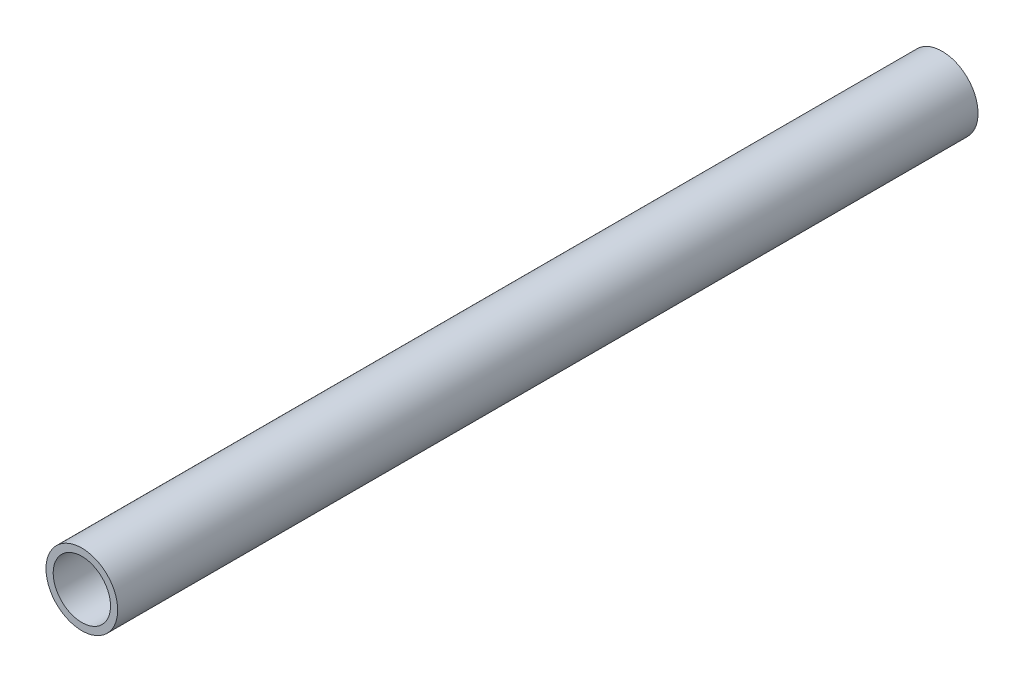
ISO-10303-21;
HEADER;
FILE_DESCRIPTION(('STEP AP214'),'2;1');
FILE_NAME('part.step','',(''),(''),'','','');
FILE_SCHEMA(('AUTOMOTIVE_DESIGN { 1 0 10303 214 1 1 1 1 }'));
ENDSEC;
DATA;
#1=APPLICATION_CONTEXT('core data for automotive mechanical design processes');
#2=APPLICATION_PROTOCOL_DEFINITION('international standard','automotive_design',2000,#1);
#3=PRODUCT_CONTEXT('',#1,'mechanical');
#4=PRODUCT('Part','Part','',(#3));
#5=PRODUCT_RELATED_PRODUCT_CATEGORY('part','',(#4));
#6=PRODUCT_DEFINITION_FORMATION('','',#4);
#7=PRODUCT_DEFINITION_CONTEXT('part definition',#1,'design');
#8=PRODUCT_DEFINITION('design','',#6,#7);
#9=PRODUCT_DEFINITION_SHAPE('','',#8);
#10=(LENGTH_UNIT() NAMED_UNIT(*) SI_UNIT(.MILLI.,.METRE.));
#11=(NAMED_UNIT(*) PLANE_ANGLE_UNIT() SI_UNIT($,.RADIAN.));
#12=(NAMED_UNIT(*) SI_UNIT($,.STERADIAN.) SOLID_ANGLE_UNIT());
#13=UNCERTAINTY_MEASURE_WITH_UNIT(LENGTH_MEASURE(1.E-05),#10,'distance_accuracy_value','');
#14=(GEOMETRIC_REPRESENTATION_CONTEXT(3) GLOBAL_UNCERTAINTY_ASSIGNED_CONTEXT((#13)) GLOBAL_UNIT_ASSIGNED_CONTEXT((#10,
#11,#12)) REPRESENTATION_CONTEXT('',''));
#15=CARTESIAN_POINT('',(0.,0.,0.));
#16=DIRECTION('',(0.,0.,1.));
#17=DIRECTION('',(1.,0.,0.));
#18=AXIS2_PLACEMENT_3D('',#15,#16,#17);
#19=CARTESIAN_POINT('',(0.,0.,0.));
#20=DIRECTION('',(0.,0.,1.));
#21=DIRECTION('',(1.,0.,0.));
#22=AXIS2_PLACEMENT_3D('',#19,#20,#21);
#23=CYLINDRICAL_SURFACE('',#22,2.5);
#24=CARTESIAN_POINT('',(0.,0.,60.));
#25=DIRECTION('',(0.,0.,1.));
#26=DIRECTION('',(1.,0.,0.));
#27=AXIS2_PLACEMENT_3D('',#24,#25,#26);
#28=CIRCLE('',#27,2.5);
#29=CARTESIAN_POINT('',(-2.5,0.,60.));
#30=VERTEX_POINT('',#29);
#31=EDGE_CURVE('E27',#30,#30,#28,.T.);
#32=ORIENTED_EDGE('',*,*,#31,.F.);
#33=DIRECTION('',(0.,0.,-1.));
#34=VECTOR('',#33,1.);
#35=CARTESIAN_POINT('',(-2.5,0.,0.));
#36=LINE('',#35,#34);
#37=CARTESIAN_POINT('',(-2.5,0.,0.));
#38=VERTEX_POINT('',#37);
#39=EDGE_CURVE('E11',#30,#38,#36,.T.);
#40=ORIENTED_EDGE('',*,*,#39,.T.);
#41=CARTESIAN_POINT('',(0.,0.,0.));
#42=DIRECTION('',(0.,0.,1.));
#43=DIRECTION('',(1.,0.,0.));
#44=AXIS2_PLACEMENT_3D('',#41,#42,#43);
#45=CIRCLE('',#44,2.5);
#46=EDGE_CURVE('E53',#38,#38,#45,.T.);
#47=ORIENTED_EDGE('',*,*,#46,.T.);
#48=ORIENTED_EDGE('',*,*,#39,.F.);
#49=EDGE_LOOP('',(#32,#40,#47,#48));
#50=FACE_BOUND('',#49,.T.);
#51=ADVANCED_FACE('F17',(#50),#23,.T.);
#52=CARTESIAN_POINT('',(0.,0.,60.));
#53=DIRECTION('',(0.,0.,1.));
#54=DIRECTION('',(1.,0.,0.));
#55=AXIS2_PLACEMENT_3D('',#52,#53,#54);
#56=PLANE('',#55);
#57=CARTESIAN_POINT('',(0.,0.,60.));
#58=DIRECTION('',(0.,0.,-1.));
#59=DIRECTION('',(1.,0.,0.));
#60=AXIS2_PLACEMENT_3D('',#57,#58,#59);
#61=CIRCLE('',#60,2.);
#62=CARTESIAN_POINT('',(-2.,0.,60.));
#63=VERTEX_POINT('',#62);
#64=EDGE_CURVE('E21',#63,#63,#61,.T.);
#65=ORIENTED_EDGE('',*,*,#64,.T.);
#66=EDGE_LOOP('',(#65));
#67=FACE_BOUND('',#66,.T.);
#68=ORIENTED_EDGE('',*,*,#31,.T.);
#69=EDGE_LOOP('',(#68));
#70=FACE_BOUND('',#69,.T.);
#71=ADVANCED_FACE('F94',(#67,#70),#56,.T.);
#72=CARTESIAN_POINT('',(0.,0.,0.));
#73=DIRECTION('',(0.,0.,1.));
#74=DIRECTION('',(1.,0.,0.));
#75=AXIS2_PLACEMENT_3D('',#72,#73,#74);
#76=CYLINDRICAL_SURFACE('',#75,2.);
#77=CARTESIAN_POINT('',(0.,0.,0.));
#78=DIRECTION('',(0.,0.,-1.));
#79=DIRECTION('',(1.,0.,0.));
#80=AXIS2_PLACEMENT_3D('',#77,#78,#79);
#81=CIRCLE('',#80,2.);
#82=CARTESIAN_POINT('',(-2.,0.,0.));
#83=VERTEX_POINT('',#82);
#84=EDGE_CURVE('E67',#83,#83,#81,.T.);
#85=ORIENTED_EDGE('',*,*,#84,.T.);
#86=DIRECTION('',(0.,0.,1.));
#87=VECTOR('',#86,1.);
#88=CARTESIAN_POINT('',(-2.,0.,0.));
#89=LINE('',#88,#87);
#90=EDGE_CURVE('E61',#83,#63,#89,.T.);
#91=ORIENTED_EDGE('',*,*,#90,.T.);
#92=ORIENTED_EDGE('',*,*,#64,.F.);
#93=ORIENTED_EDGE('',*,*,#90,.F.);
#94=EDGE_LOOP('',(#85,#91,#92,#93));
#95=FACE_BOUND('',#94,.T.);
#96=ADVANCED_FACE('F19',(#95),#76,.F.);
#97=CARTESIAN_POINT('',(0.,0.,0.));
#98=DIRECTION('',(0.,0.,1.));
#99=DIRECTION('',(1.,0.,0.));
#100=AXIS2_PLACEMENT_3D('',#97,#98,#99);
#101=PLANE('',#100);
#102=ORIENTED_EDGE('',*,*,#84,.F.);
#103=EDGE_LOOP('',(#102));
#104=FACE_BOUND('',#103,.T.);
#105=ORIENTED_EDGE('',*,*,#46,.F.);
#106=EDGE_LOOP('',(#105));
#107=FACE_BOUND('',#106,.T.);
#108=ADVANCED_FACE('F110',(#104,#107),#101,.F.);
#109=CLOSED_SHELL('',(#51,#71,#96,#108));
#110=MANIFOLD_SOLID_BREP('B1',#109);
#111=ADVANCED_BREP_SHAPE_REPRESENTATION('',(#18,#110),#14);
#112=SHAPE_DEFINITION_REPRESENTATION(#9,#111);
ENDSEC;
END-ISO-10303-21;
